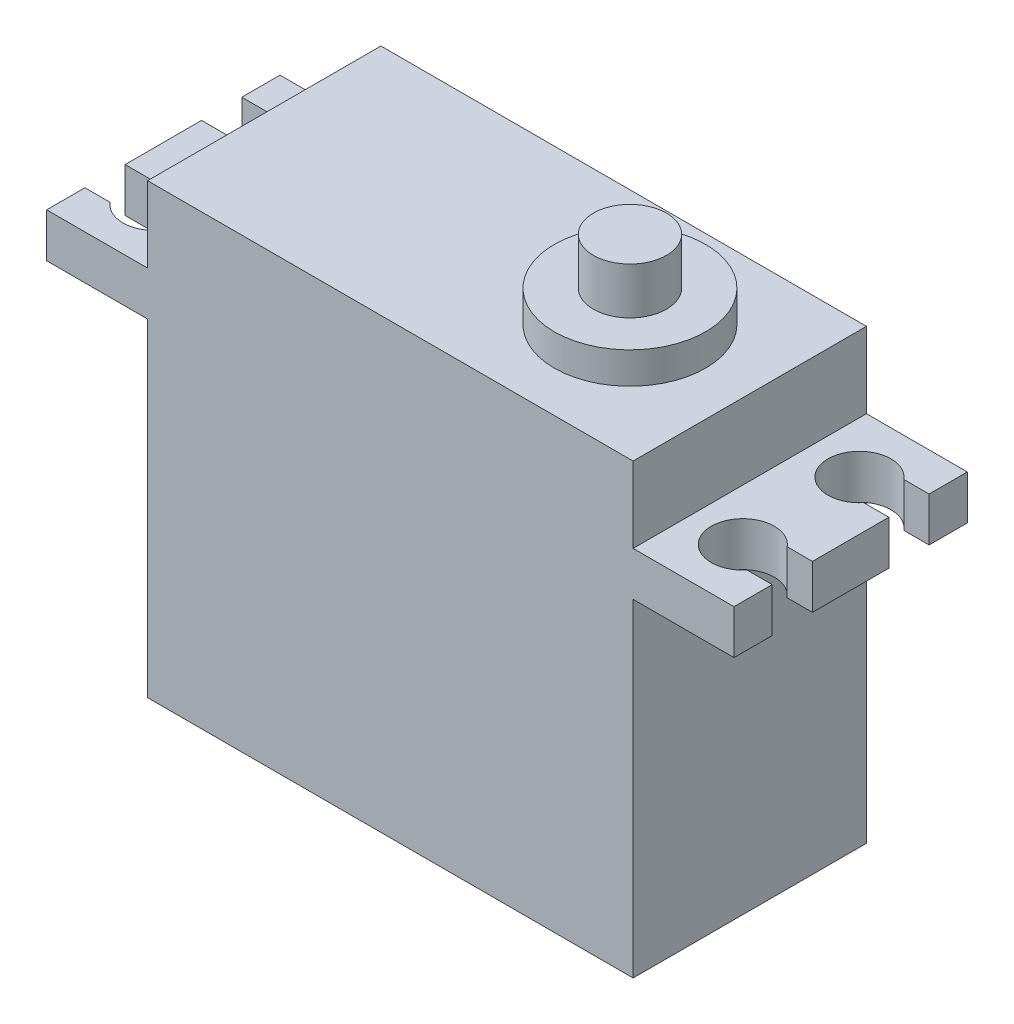
ISO-10303-21;
HEADER;
FILE_DESCRIPTION(('STEP AP214'),'2;1');
FILE_NAME('part.step','',(''),(''),'','','');
FILE_SCHEMA(('AUTOMOTIVE_DESIGN { 1 0 10303 214 1 1 1 1 }'));
ENDSEC;
DATA;
#1=APPLICATION_CONTEXT('core data for automotive mechanical design processes');
#2=APPLICATION_PROTOCOL_DEFINITION('international standard','automotive_design',2000,#1);
#3=PRODUCT_CONTEXT('',#1,'mechanical');
#4=PRODUCT('Part','Part','',(#3));
#5=PRODUCT_RELATED_PRODUCT_CATEGORY('part','',(#4));
#6=PRODUCT_DEFINITION_FORMATION('','',#4);
#7=PRODUCT_DEFINITION_CONTEXT('part definition',#1,'design');
#8=PRODUCT_DEFINITION('design','',#6,#7);
#9=PRODUCT_DEFINITION_SHAPE('','',#8);
#10=(LENGTH_UNIT() NAMED_UNIT(*) SI_UNIT(.MILLI.,.METRE.));
#11=(NAMED_UNIT(*) PLANE_ANGLE_UNIT() SI_UNIT($,.RADIAN.));
#12=(NAMED_UNIT(*) SI_UNIT($,.STERADIAN.) SOLID_ANGLE_UNIT());
#13=UNCERTAINTY_MEASURE_WITH_UNIT(LENGTH_MEASURE(1.E-05),#10,'distance_accuracy_value','');
#14=(GEOMETRIC_REPRESENTATION_CONTEXT(3) GLOBAL_UNCERTAINTY_ASSIGNED_CONTEXT((#13)) GLOBAL_UNIT_ASSIGNED_CONTEXT((#10,
#11,#12)) REPRESENTATION_CONTEXT('',''));
#15=CARTESIAN_POINT('',(0.,0.,0.));
#16=DIRECTION('',(0.,0.,1.));
#17=DIRECTION('',(1.,0.,0.));
#18=AXIS2_PLACEMENT_3D('',#15,#16,#17);
#19=CARTESIAN_POINT('',(-9.3497990620132,3.37443308731617,18.5));
#20=DIRECTION('',(0.,-1.,0.));
#21=DIRECTION('',(0.,0.,-1.));
#22=AXIS2_PLACEMENT_3D('',#19,#20,#21);
#23=PLANE('',#22);
#24=DIRECTION('',(0.,0.,1.));
#25=VECTOR('',#24,1.);
#26=CARTESIAN_POINT('',(-1.3497990620132,3.37443308731617,0.));
#27=LINE('',#26,#25);
#28=CARTESIAN_POINT('',(-1.3497990620132,3.37443308731617,0.));
#29=VERTEX_POINT('',#28);
#30=CARTESIAN_POINT('',(-1.3497990620132,3.37443308731617,18.5));
#31=VERTEX_POINT('',#30);
#32=EDGE_CURVE('E242',#29,#31,#27,.T.);
#33=ORIENTED_EDGE('',*,*,#32,.F.);
#34=DIRECTION('',(-1.,0.,0.));
#35=VECTOR('',#34,1.);
#36=CARTESIAN_POINT('',(-9.3497990620132,3.37443308731617,0.));
#37=LINE('',#36,#35);
#38=CARTESIAN_POINT('',(-9.3497990620132,3.37443308731617,0.));
#39=VERTEX_POINT('',#38);
#40=EDGE_CURVE('E375',#29,#39,#37,.T.);
#41=ORIENTED_EDGE('',*,*,#40,.T.);
#42=DIRECTION('',(0.,0.,-1.));
#43=VECTOR('',#42,1.);
#44=CARTESIAN_POINT('',(-9.3497990620132,3.37443308731617,18.5));
#45=LINE('',#44,#43);
#46=CARTESIAN_POINT('',(-9.3497990620132,3.37443308731617,3.03171141481607));
#47=VERTEX_POINT('',#46);
#48=EDGE_CURVE('E383',#47,#39,#45,.T.);
#49=ORIENTED_EDGE('',*,*,#48,.F.);
#50=DIRECTION('',(-1.,0.,0.));
#51=VECTOR('',#50,1.);
#52=CARTESIAN_POINT('',(-9.3497990620132,3.37443308731617,3.03171141481607));
#53=LINE('',#52,#51);
#54=CARTESIAN_POINT('',(-7.3497990620132,3.37443308731617,3.03171141481607));
#55=VERTEX_POINT('',#54);
#56=EDGE_CURVE('E290',#55,#47,#53,.T.);
#57=ORIENTED_EDGE('',*,*,#56,.F.);
#58=CARTESIAN_POINT('',(-5.42329147460987,3.37443308731617,4.625));
#59=DIRECTION('',(0.,1.,0.));
#60=DIRECTION('',(0.,0.,1.));
#61=AXIS2_PLACEMENT_3D('',#58,#59,#60);
#62=CIRCLE('',#61,2.5);
#63=CARTESIAN_POINT('',(-7.3497990620132,3.37443308731617,6.21828858518393));
#64=VERTEX_POINT('',#63);
#65=EDGE_CURVE('E287',#64,#55,#62,.T.);
#66=ORIENTED_EDGE('',*,*,#65,.F.);
#67=DIRECTION('',(1.,0.,0.));
#68=VECTOR('',#67,1.);
#69=CARTESIAN_POINT('',(-9.3497990620132,3.37443308731617,6.21828858518393));
#70=LINE('',#69,#68);
#71=CARTESIAN_POINT('',(-9.3497990620132,3.37443308731617,6.21828858518393));
#72=VERTEX_POINT('',#71);
#73=EDGE_CURVE('E260',#72,#64,#70,.T.);
#74=ORIENTED_EDGE('',*,*,#73,.F.);
#75=CARTESIAN_POINT('',(-9.3497990620132,3.37443308731617,12.2817114148161));
#76=VERTEX_POINT('',#75);
#77=EDGE_CURVE('E389',#76,#72,#45,.T.);
#78=ORIENTED_EDGE('',*,*,#77,.F.);
#79=DIRECTION('',(-1.,0.,0.));
#80=VECTOR('',#79,1.);
#81=CARTESIAN_POINT('',(-9.3497990620132,3.37443308731617,12.2817114148161));
#82=LINE('',#81,#80);
#83=CARTESIAN_POINT('',(-7.3497990620132,3.37443308731617,12.2817114148161));
#84=VERTEX_POINT('',#83);
#85=EDGE_CURVE('E300',#84,#76,#82,.T.);
#86=ORIENTED_EDGE('',*,*,#85,.F.);
#87=CARTESIAN_POINT('',(-5.42329147460987,3.37443308731617,13.875));
#88=DIRECTION('',(0.,1.,0.));
#89=DIRECTION('',(0.,0.,-1.));
#90=AXIS2_PLACEMENT_3D('',#87,#88,#89);
#91=CIRCLE('',#90,2.5);
#92=CARTESIAN_POINT('',(-7.3497990620132,3.37443308731617,15.4682885851839));
#93=VERTEX_POINT('',#92);
#94=EDGE_CURVE('E297',#93,#84,#91,.T.);
#95=ORIENTED_EDGE('',*,*,#94,.F.);
#96=DIRECTION('',(1.,0.,0.));
#97=VECTOR('',#96,1.);
#98=CARTESIAN_POINT('',(-9.3497990620132,3.37443308731617,15.4682885851839));
#99=LINE('',#98,#97);
#100=CARTESIAN_POINT('',(-9.3497990620132,3.37443308731617,15.4682885851839));
#101=VERTEX_POINT('',#100);
#102=EDGE_CURVE('E279',#101,#93,#99,.T.);
#103=ORIENTED_EDGE('',*,*,#102,.F.);
#104=CARTESIAN_POINT('',(-9.3497990620132,3.37443308731617,18.5));
#105=VERTEX_POINT('',#104);
#106=EDGE_CURVE('E385',#105,#101,#45,.T.);
#107=ORIENTED_EDGE('',*,*,#106,.F.);
#108=DIRECTION('',(-1.,0.,0.));
#109=VECTOR('',#108,1.);
#110=CARTESIAN_POINT('',(-9.3497990620132,3.37443308731617,18.5));
#111=LINE('',#110,#109);
#112=EDGE_CURVE('E49',#31,#105,#111,.T.);
#113=ORIENTED_EDGE('',*,*,#112,.F.);
#114=EDGE_LOOP('',(#33,#41,#49,#57,#66,#74,#78,#86,#95,#103,#107,#113));
#115=FACE_BOUND('',#114,.T.);
#116=ADVANCED_FACE('F33',(#115),#23,.F.);
#117=DIRECTION('',(0.,0.,-1.));
#118=VECTOR('',#117,1.);
#119=CARTESIAN_POINT('',(37.1502009379868,3.37443308731617,18.5));
#120=LINE('',#119,#118);
#121=CARTESIAN_POINT('',(37.1502009379868,3.37443308731617,18.5));
#122=VERTEX_POINT('',#121);
#123=CARTESIAN_POINT('',(37.1502009379868,3.37443308731617,0.));
#124=VERTEX_POINT('',#123);
#125=EDGE_CURVE('E57',#122,#124,#120,.T.);
#126=ORIENTED_EDGE('',*,*,#125,.F.);
#127=CARTESIAN_POINT('',(45.1502009379868,3.37443308731617,18.5));
#128=VERTEX_POINT('',#127);
#129=EDGE_CURVE('E356',#128,#122,#111,.T.);
#130=ORIENTED_EDGE('',*,*,#129,.F.);
#131=DIRECTION('',(0.,0.,-1.));
#132=VECTOR('',#131,1.);
#133=CARTESIAN_POINT('',(45.1502009379868,3.37443308731617,18.5));
#134=LINE('',#133,#132);
#135=CARTESIAN_POINT('',(45.1502009379868,3.37443308731617,15.4682885851839));
#136=VERTEX_POINT('',#135);
#137=EDGE_CURVE('E390',#128,#136,#134,.T.);
#138=ORIENTED_EDGE('',*,*,#137,.T.);
#139=DIRECTION('',(1.,0.,0.));
#140=VECTOR('',#139,1.);
#141=CARTESIAN_POINT('',(45.1502009379868,3.37443308731617,15.4682885851839));
#142=LINE('',#141,#140);
#143=CARTESIAN_POINT('',(43.1502009379868,3.37443308731617,15.4682885851839));
#144=VERTEX_POINT('',#143);
#145=EDGE_CURVE('E273',#144,#136,#142,.T.);
#146=ORIENTED_EDGE('',*,*,#145,.F.);
#147=CARTESIAN_POINT('',(41.2236933505835,3.37443308731617,13.875));
#148=DIRECTION('',(0.,1.,0.));
#149=DIRECTION('',(0.,0.,1.));
#150=AXIS2_PLACEMENT_3D('',#147,#148,#149);
#151=CIRCLE('',#150,2.5);
#152=CARTESIAN_POINT('',(43.1502009379868,3.37443308731617,12.2817114148161));
#153=VERTEX_POINT('',#152);
#154=EDGE_CURVE('E269',#153,#144,#151,.T.);
#155=ORIENTED_EDGE('',*,*,#154,.F.);
#156=DIRECTION('',(-1.,0.,0.));
#157=VECTOR('',#156,1.);
#158=CARTESIAN_POINT('',(45.1502009379868,3.37443308731617,12.2817114148161));
#159=LINE('',#158,#157);
#160=CARTESIAN_POINT('',(45.1502009379868,3.37443308731617,12.2817114148161));
#161=VERTEX_POINT('',#160);
#162=EDGE_CURVE('E266',#161,#153,#159,.T.);
#163=ORIENTED_EDGE('',*,*,#162,.F.);
#164=CARTESIAN_POINT('',(45.1502009379868,3.37443308731617,6.21828858518393));
#165=VERTEX_POINT('',#164);
#166=EDGE_CURVE('E394',#161,#165,#134,.T.);
#167=ORIENTED_EDGE('',*,*,#166,.T.);
#168=DIRECTION('',(1.,0.,0.));
#169=VECTOR('',#168,1.);
#170=CARTESIAN_POINT('',(45.1502009379868,3.37443308731617,6.21828858518393));
#171=LINE('',#170,#169);
#172=CARTESIAN_POINT('',(43.1502009379868,3.37443308731617,6.21828858518393));
#173=VERTEX_POINT('',#172);
#174=EDGE_CURVE('E254',#173,#165,#171,.T.);
#175=ORIENTED_EDGE('',*,*,#174,.F.);
#176=CARTESIAN_POINT('',(41.2236933505835,3.37443308731617,4.625));
#177=DIRECTION('',(0.,1.,0.));
#178=DIRECTION('',(0.,0.,-1.));
#179=AXIS2_PLACEMENT_3D('',#176,#177,#178);
#180=CIRCLE('',#179,2.5);
#181=CARTESIAN_POINT('',(43.1502009379868,3.37443308731617,3.03171141481607));
#182=VERTEX_POINT('',#181);
#183=EDGE_CURVE('E246',#182,#173,#180,.T.);
#184=ORIENTED_EDGE('',*,*,#183,.F.);
#185=DIRECTION('',(-1.,0.,0.));
#186=VECTOR('',#185,1.);
#187=CARTESIAN_POINT('',(45.1502009379868,3.37443308731617,3.03171141481607));
#188=LINE('',#187,#186);
#189=CARTESIAN_POINT('',(45.1502009379868,3.37443308731617,3.03171141481607));
#190=VERTEX_POINT('',#189);
#191=EDGE_CURVE('E243',#190,#182,#188,.T.);
#192=ORIENTED_EDGE('',*,*,#191,.F.);
#193=CARTESIAN_POINT('',(45.1502009379868,3.37443308731617,0.));
#194=VERTEX_POINT('',#193);
#195=EDGE_CURVE('E388',#190,#194,#134,.T.);
#196=ORIENTED_EDGE('',*,*,#195,.T.);
#197=EDGE_CURVE('E376',#194,#124,#37,.T.);
#198=ORIENTED_EDGE('',*,*,#197,.T.);
#199=EDGE_LOOP('',(#126,#130,#138,#146,#155,#163,#167,#175,#184,#192,#196,#198));
#200=FACE_BOUND('',#199,.T.);
#201=ADVANCED_FACE('F476',(#200),#23,.F.);
#202=CARTESIAN_POINT('',(45.1502009379868,3.37443308731617,18.5));
#203=DIRECTION('',(-1.,0.,0.));
#204=DIRECTION('',(0.,0.,1.));
#205=AXIS2_PLACEMENT_3D('',#202,#203,#204);
#206=PLANE('',#205);
#207=DIRECTION('',(0.,0.,-1.));
#208=VECTOR('',#207,1.);
#209=CARTESIAN_POINT('',(45.1502009379868,-0.125566912683819,18.5));
#210=LINE('',#209,#208);
#211=CARTESIAN_POINT('',(45.1502009379868,-0.125566912683819,18.5));
#212=VERTEX_POINT('',#211);
#213=CARTESIAN_POINT('',(45.1502009379868,-0.125566912683818,15.4682885851839));
#214=VERTEX_POINT('',#213);
#215=EDGE_CURVE('E395',#212,#214,#210,.T.);
#216=ORIENTED_EDGE('',*,*,#215,.T.);
#217=DIRECTION('',(0.,1.,0.));
#218=VECTOR('',#217,1.);
#219=CARTESIAN_POINT('',(45.1502009379868,-26.1255669126838,15.4682885851839));
#220=LINE('',#219,#218);
#221=EDGE_CURVE('E276',#214,#136,#220,.T.);
#222=ORIENTED_EDGE('',*,*,#221,.T.);
#223=ORIENTED_EDGE('',*,*,#137,.F.);
#224=DIRECTION('',(0.,1.,0.));
#225=VECTOR('',#224,1.);
#226=CARTESIAN_POINT('',(45.1502009379868,3.37443308731617,18.5));
#227=LINE('',#226,#225);
#228=EDGE_CURVE('E354',#212,#128,#227,.T.);
#229=ORIENTED_EDGE('',*,*,#228,.F.);
#230=EDGE_LOOP('',(#216,#222,#223,#229));
#231=FACE_BOUND('',#230,.T.);
#232=ADVANCED_FACE('F481',(#231),#206,.F.);
#233=ORIENTED_EDGE('',*,*,#166,.F.);
#234=DIRECTION('',(0.,1.,0.));
#235=VECTOR('',#234,1.);
#236=CARTESIAN_POINT('',(45.1502009379868,-26.1255669126838,12.2817114148161));
#237=LINE('',#236,#235);
#238=CARTESIAN_POINT('',(45.1502009379868,-0.125566912683818,12.2817114148161));
#239=VERTEX_POINT('',#238);
#240=EDGE_CURVE('E275',#239,#161,#237,.T.);
#241=ORIENTED_EDGE('',*,*,#240,.F.);
#242=CARTESIAN_POINT('',(45.1502009379868,-0.125566912683818,6.21828858518393));
#243=VERTEX_POINT('',#242);
#244=EDGE_CURVE('E399',#239,#243,#210,.T.);
#245=ORIENTED_EDGE('',*,*,#244,.T.);
#246=DIRECTION('',(0.,1.,0.));
#247=VECTOR('',#246,1.);
#248=CARTESIAN_POINT('',(45.1502009379868,-26.1255669126838,6.21828858518393));
#249=LINE('',#248,#247);
#250=EDGE_CURVE('E257',#243,#165,#249,.T.);
#251=ORIENTED_EDGE('',*,*,#250,.T.);
#252=EDGE_LOOP('',(#233,#241,#245,#251));
#253=FACE_BOUND('',#252,.T.);
#254=ADVANCED_FACE('F490',(#253),#206,.F.);
#255=CARTESIAN_POINT('',(-9.3497990620132,-0.125566912683826,18.5));
#256=DIRECTION('',(1.,0.,0.));
#257=DIRECTION('',(0.,0.,-1.));
#258=AXIS2_PLACEMENT_3D('',#255,#256,#257);
#259=PLANE('',#258);
#260=DIRECTION('',(0.,0.,-1.));
#261=VECTOR('',#260,1.);
#262=CARTESIAN_POINT('',(-9.3497990620132,-0.125566912683826,18.5));
#263=LINE('',#262,#261);
#264=CARTESIAN_POINT('',(-9.3497990620132,-0.125566912683825,3.03171141481607));
#265=VERTEX_POINT('',#264);
#266=CARTESIAN_POINT('',(-9.3497990620132,-0.125566912683826,0.));
#267=VERTEX_POINT('',#266);
#268=EDGE_CURVE('E360',#265,#267,#263,.T.);
#269=ORIENTED_EDGE('',*,*,#268,.F.);
#270=DIRECTION('',(0.,1.,0.));
#271=VECTOR('',#270,1.);
#272=CARTESIAN_POINT('',(-9.3497990620132,-0.125566912683826,3.03171141481607));
#273=LINE('',#272,#271);
#274=EDGE_CURVE('E37',#265,#47,#273,.T.);
#275=ORIENTED_EDGE('',*,*,#274,.T.);
#276=ORIENTED_EDGE('',*,*,#48,.T.);
#277=DIRECTION('',(0.,-1.,0.));
#278=VECTOR('',#277,1.);
#279=CARTESIAN_POINT('',(-9.3497990620132,-0.125566912683826,0.));
#280=LINE('',#279,#278);
#281=EDGE_CURVE('E346',#39,#267,#280,.T.);
#282=ORIENTED_EDGE('',*,*,#281,.T.);
#283=EDGE_LOOP('',(#269,#275,#276,#282));
#284=FACE_BOUND('',#283,.T.);
#285=ADVANCED_FACE('F427',(#284),#259,.F.);
#286=ORIENTED_EDGE('',*,*,#77,.T.);
#287=DIRECTION('',(0.,-1.,0.));
#288=VECTOR('',#287,1.);
#289=CARTESIAN_POINT('',(-9.3497990620132,-0.125566912683826,6.21828858518393));
#290=LINE('',#289,#288);
#291=CARTESIAN_POINT('',(-9.3497990620132,-0.125566912683826,6.21828858518393));
#292=VERTEX_POINT('',#291);
#293=EDGE_CURVE('E416',#72,#292,#290,.T.);
#294=ORIENTED_EDGE('',*,*,#293,.T.);
#295=CARTESIAN_POINT('',(-9.3497990620132,-0.125566912683825,12.2817114148161));
#296=VERTEX_POINT('',#295);
#297=EDGE_CURVE('E384',#296,#292,#263,.T.);
#298=ORIENTED_EDGE('',*,*,#297,.F.);
#299=DIRECTION('',(0.,1.,0.));
#300=VECTOR('',#299,1.);
#301=CARTESIAN_POINT('',(-9.3497990620132,-0.125566912683826,12.2817114148161));
#302=LINE('',#301,#300);
#303=EDGE_CURVE('E414',#296,#76,#302,.T.);
#304=ORIENTED_EDGE('',*,*,#303,.T.);
#305=EDGE_LOOP('',(#286,#294,#298,#304));
#306=FACE_BOUND('',#305,.T.);
#307=ADVANCED_FACE('F434',(#306),#259,.F.);
#308=CARTESIAN_POINT('',(-1.3497990620132,-0.125566912683824,18.5));
#309=DIRECTION('',(0.,1.,0.));
#310=DIRECTION('',(-1.,0.,0.));
#311=AXIS2_PLACEMENT_3D('',#308,#309,#310);
#312=PLANE('',#311);
#313=CARTESIAN_POINT('',(-5.42329147460987,-0.125566912683825,4.625));
#314=DIRECTION('',(0.,1.,0.));
#315=DIRECTION('',(-1.,0.,0.));
#316=AXIS2_PLACEMENT_3D('',#313,#314,#315);
#317=CIRCLE('',#316,2.5);
#318=CARTESIAN_POINT('',(-7.3497990620132,-0.125566912683825,6.21828858518393));
#319=VERTEX_POINT('',#318);
#320=CARTESIAN_POINT('',(-7.3497990620132,-0.125566912683825,3.03171141481607));
#321=VERTEX_POINT('',#320);
#322=EDGE_CURVE('E330',#319,#321,#317,.T.);
#323=ORIENTED_EDGE('',*,*,#322,.T.);
#324=DIRECTION('',(-1.,0.,0.));
#325=VECTOR('',#324,1.);
#326=CARTESIAN_POINT('',(-1.3497990620132,-0.125566912683824,3.03171141481607));
#327=LINE('',#326,#325);
#328=EDGE_CURVE('E315',#321,#265,#327,.T.);
#329=ORIENTED_EDGE('',*,*,#328,.T.);
#330=ORIENTED_EDGE('',*,*,#268,.T.);
#331=DIRECTION('',(1.,0.,0.));
#332=VECTOR('',#331,1.);
#333=CARTESIAN_POINT('',(-1.3497990620132,-0.125566912683824,0.));
#334=LINE('',#333,#332);
#335=CARTESIAN_POINT('',(-1.3497990620132,-0.125566912683824,0.));
#336=VERTEX_POINT('',#335);
#337=EDGE_CURVE('E342',#267,#336,#334,.T.);
#338=ORIENTED_EDGE('',*,*,#337,.T.);
#339=DIRECTION('',(0.,0.,-1.));
#340=VECTOR('',#339,1.);
#341=CARTESIAN_POINT('',(-1.3497990620132,-0.125566912683824,18.5));
#342=LINE('',#341,#340);
#343=CARTESIAN_POINT('',(-1.3497990620132,-0.125566912683824,18.5));
#344=VERTEX_POINT('',#343);
#345=EDGE_CURVE('E408',#344,#336,#342,.T.);
#346=ORIENTED_EDGE('',*,*,#345,.F.);
#347=DIRECTION('',(1.,0.,0.));
#348=VECTOR('',#347,1.);
#349=CARTESIAN_POINT('',(-1.3497990620132,-0.125566912683824,18.5));
#350=LINE('',#349,#348);
#351=CARTESIAN_POINT('',(-9.3497990620132,-0.125566912683826,18.5));
#352=VERTEX_POINT('',#351);
#353=EDGE_CURVE('E343',#352,#344,#350,.T.);
#354=ORIENTED_EDGE('',*,*,#353,.F.);
#355=CARTESIAN_POINT('',(-9.3497990620132,-0.125566912683826,15.4682885851839));
#356=VERTEX_POINT('',#355);
#357=EDGE_CURVE('E380',#352,#356,#263,.T.);
#358=ORIENTED_EDGE('',*,*,#357,.T.);
#359=DIRECTION('',(1.,0.,0.));
#360=VECTOR('',#359,1.);
#361=CARTESIAN_POINT('',(-1.3497990620132,-0.125566912683824,15.4682885851839));
#362=LINE('',#361,#360);
#363=CARTESIAN_POINT('',(-7.3497990620132,-0.125566912683825,15.4682885851839));
#364=VERTEX_POINT('',#363);
#365=EDGE_CURVE('E305',#356,#364,#362,.T.);
#366=ORIENTED_EDGE('',*,*,#365,.T.);
#367=CARTESIAN_POINT('',(-5.42329147460987,-0.125566912683825,13.875));
#368=DIRECTION('',(0.,1.,0.));
#369=DIRECTION('',(-1.,0.,0.));
#370=AXIS2_PLACEMENT_3D('',#367,#368,#369);
#371=CIRCLE('',#370,2.5);
#372=CARTESIAN_POINT('',(-7.3497990620132,-0.125566912683825,12.2817114148161));
#373=VERTEX_POINT('',#372);
#374=EDGE_CURVE('E318',#364,#373,#371,.T.);
#375=ORIENTED_EDGE('',*,*,#374,.T.);
#376=DIRECTION('',(-1.,0.,0.));
#377=VECTOR('',#376,1.);
#378=CARTESIAN_POINT('',(-1.3497990620132,-0.125566912683824,12.2817114148161));
#379=LINE('',#378,#377);
#380=EDGE_CURVE('E309',#373,#296,#379,.T.);
#381=ORIENTED_EDGE('',*,*,#380,.T.);
#382=ORIENTED_EDGE('',*,*,#297,.T.);
#383=DIRECTION('',(1.,0.,0.));
#384=VECTOR('',#383,1.);
#385=CARTESIAN_POINT('',(-1.3497990620132,-0.125566912683824,6.21828858518393));
#386=LINE('',#385,#384);
#387=EDGE_CURVE('E312',#292,#319,#386,.T.);
#388=ORIENTED_EDGE('',*,*,#387,.T.);
#389=EDGE_LOOP('',(#323,#329,#330,#338,#346,#354,#358,#366,#375,#381,#382,#388));
#390=FACE_BOUND('',#389,.T.);
#391=ADVANCED_FACE('F35',(#390),#312,.F.);
#392=CARTESIAN_POINT('',(-1.3497990620132,-26.1255669126838,18.5));
#393=DIRECTION('',(1.,0.,0.));
#394=DIRECTION('',(0.,0.,-1.));
#395=AXIS2_PLACEMENT_3D('',#392,#393,#394);
#396=PLANE('',#395);
#397=DIRECTION('',(0.,-1.,0.));
#398=VECTOR('',#397,1.);
#399=CARTESIAN_POINT('',(-1.3497990620132,-26.1255669126838,0.));
#400=LINE('',#399,#398);
#401=CARTESIAN_POINT('',(-1.3497990620132,-26.1255669126838,0.));
#402=VERTEX_POINT('',#401);
#403=EDGE_CURVE('E363',#336,#402,#400,.T.);
#404=ORIENTED_EDGE('',*,*,#403,.T.);
#405=DIRECTION('',(0.,0.,-1.));
#406=VECTOR('',#405,1.);
#407=CARTESIAN_POINT('',(-1.3497990620132,-26.1255669126838,18.5));
#408=LINE('',#407,#406);
#409=CARTESIAN_POINT('',(-1.3497990620132,-26.1255669126838,18.5));
#410=VERTEX_POINT('',#409);
#411=EDGE_CURVE('E405',#410,#402,#408,.T.);
#412=ORIENTED_EDGE('',*,*,#411,.F.);
#413=DIRECTION('',(0.,-1.,0.));
#414=VECTOR('',#413,1.);
#415=CARTESIAN_POINT('',(-1.3497990620132,-26.1255669126838,18.5));
#416=LINE('',#415,#414);
#417=EDGE_CURVE('E345',#344,#410,#416,.T.);
#418=ORIENTED_EDGE('',*,*,#417,.F.);
#419=ORIENTED_EDGE('',*,*,#345,.T.);
#420=EDGE_LOOP('',(#404,#412,#418,#419));
#421=FACE_BOUND('',#420,.T.);
#422=ADVANCED_FACE('F450',(#421),#396,.F.);
#423=CARTESIAN_POINT('',(37.1502009379868,-26.1255669126838,18.5));
#424=DIRECTION('',(0.,1.,0.));
#425=DIRECTION('',(-1.,0.,0.));
#426=AXIS2_PLACEMENT_3D('',#423,#424,#425);
#427=PLANE('',#426);
#428=DIRECTION('',(1.,0.,0.));
#429=VECTOR('',#428,1.);
#430=CARTESIAN_POINT('',(37.1502009379868,-26.1255669126838,0.));
#431=LINE('',#430,#429);
#432=CARTESIAN_POINT('',(37.1502009379868,-26.1255669126838,0.));
#433=VERTEX_POINT('',#432);
#434=EDGE_CURVE('E365',#402,#433,#431,.T.);
#435=ORIENTED_EDGE('',*,*,#434,.T.);
#436=DIRECTION('',(0.,0.,-1.));
#437=VECTOR('',#436,1.);
#438=CARTESIAN_POINT('',(37.1502009379868,-26.1255669126838,18.5));
#439=LINE('',#438,#437);
#440=CARTESIAN_POINT('',(37.1502009379868,-26.1255669126838,18.5));
#441=VERTEX_POINT('',#440);
#442=EDGE_CURVE('E402',#441,#433,#439,.T.);
#443=ORIENTED_EDGE('',*,*,#442,.F.);
#444=DIRECTION('',(1.,0.,0.));
#445=VECTOR('',#444,1.);
#446=CARTESIAN_POINT('',(37.1502009379868,-26.1255669126838,18.5));
#447=LINE('',#446,#445);
#448=EDGE_CURVE('E348',#410,#441,#447,.T.);
#449=ORIENTED_EDGE('',*,*,#448,.F.);
#450=ORIENTED_EDGE('',*,*,#411,.T.);
#451=EDGE_LOOP('',(#435,#443,#449,#450));
#452=FACE_BOUND('',#451,.T.);
#453=ADVANCED_FACE('F497',(#452),#427,.F.);
#454=CARTESIAN_POINT('',(37.1502009379868,-0.125566912683821,18.5));
#455=DIRECTION('',(-1.,0.,0.));
#456=DIRECTION('',(0.,0.,1.));
#457=AXIS2_PLACEMENT_3D('',#454,#455,#456);
#458=PLANE('',#457);
#459=DIRECTION('',(0.,1.,0.));
#460=VECTOR('',#459,1.);
#461=CARTESIAN_POINT('',(37.1502009379868,-0.125566912683821,0.));
#462=LINE('',#461,#460);
#463=CARTESIAN_POINT('',(37.1502009379868,-0.125566912683821,0.));
#464=VERTEX_POINT('',#463);
#465=EDGE_CURVE('E367',#433,#464,#462,.T.);
#466=ORIENTED_EDGE('',*,*,#465,.T.);
#467=DIRECTION('',(0.,0.,-1.));
#468=VECTOR('',#467,1.);
#469=CARTESIAN_POINT('',(37.1502009379868,-0.125566912683821,18.5));
#470=LINE('',#469,#468);
#471=CARTESIAN_POINT('',(37.1502009379868,-0.125566912683821,18.5));
#472=VERTEX_POINT('',#471);
#473=EDGE_CURVE('E398',#472,#464,#470,.T.);
#474=ORIENTED_EDGE('',*,*,#473,.F.);
#475=DIRECTION('',(0.,1.,0.));
#476=VECTOR('',#475,1.);
#477=CARTESIAN_POINT('',(37.1502009379868,-0.125566912683821,18.5));
#478=LINE('',#477,#476);
#479=EDGE_CURVE('E350',#441,#472,#478,.T.);
#480=ORIENTED_EDGE('',*,*,#479,.F.);
#481=ORIENTED_EDGE('',*,*,#442,.T.);
#482=EDGE_LOOP('',(#466,#474,#480,#481));
#483=FACE_BOUND('',#482,.T.);
#484=ADVANCED_FACE('F493',(#483),#458,.F.);
#485=CARTESIAN_POINT('',(45.1502009379868,-0.125566912683819,18.5));
#486=DIRECTION('',(0.,1.,0.));
#487=DIRECTION('',(-1.,0.,0.));
#488=AXIS2_PLACEMENT_3D('',#485,#486,#487);
#489=PLANE('',#488);
#490=CARTESIAN_POINT('',(41.2236933505835,-0.125566912683818,13.875));
#491=DIRECTION('',(0.,1.,0.));
#492=DIRECTION('',(-1.,0.,0.));
#493=AXIS2_PLACEMENT_3D('',#490,#491,#492);
#494=CIRCLE('',#493,2.5);
#495=CARTESIAN_POINT('',(43.1502009379868,-0.125566912683818,12.2817114148161));
#496=VERTEX_POINT('',#495);
#497=CARTESIAN_POINT('',(43.1502009379868,-0.125566912683818,15.4682885851839));
#498=VERTEX_POINT('',#497);
#499=EDGE_CURVE('E336',#496,#498,#494,.T.);
#500=ORIENTED_EDGE('',*,*,#499,.T.);
#501=DIRECTION('',(1.,0.,0.));
#502=VECTOR('',#501,1.);
#503=CARTESIAN_POINT('',(45.1502009379868,-0.125566912683819,15.4682885851839));
#504=LINE('',#503,#502);
#505=EDGE_CURVE('E339',#498,#214,#504,.T.);
#506=ORIENTED_EDGE('',*,*,#505,.T.);
#507=ORIENTED_EDGE('',*,*,#215,.F.);
#508=DIRECTION('',(1.,0.,0.));
#509=VECTOR('',#508,1.);
#510=CARTESIAN_POINT('',(45.1502009379868,-0.125566912683819,18.5));
#511=LINE('',#510,#509);
#512=EDGE_CURVE('E352',#472,#212,#511,.T.);
#513=ORIENTED_EDGE('',*,*,#512,.F.);
#514=ORIENTED_EDGE('',*,*,#473,.T.);
#515=DIRECTION('',(1.,0.,0.));
#516=VECTOR('',#515,1.);
#517=CARTESIAN_POINT('',(45.1502009379868,-0.125566912683819,0.));
#518=LINE('',#517,#516);
#519=CARTESIAN_POINT('',(45.1502009379868,-0.125566912683819,0.));
#520=VERTEX_POINT('',#519);
#521=EDGE_CURVE('E369',#464,#520,#518,.T.);
#522=ORIENTED_EDGE('',*,*,#521,.T.);
#523=CARTESIAN_POINT('',(45.1502009379868,-0.125566912683818,3.03171141481607));
#524=VERTEX_POINT('',#523);
#525=EDGE_CURVE('E393',#524,#520,#210,.T.);
#526=ORIENTED_EDGE('',*,*,#525,.F.);
#527=DIRECTION('',(-1.,0.,0.));
#528=VECTOR('',#527,1.);
#529=CARTESIAN_POINT('',(45.1502009379868,-0.125566912683819,3.03171141481607));
#530=LINE('',#529,#528);
#531=CARTESIAN_POINT('',(43.1502009379868,-0.125566912683818,3.03171141481607));
#532=VERTEX_POINT('',#531);
#533=EDGE_CURVE('E321',#524,#532,#530,.T.);
#534=ORIENTED_EDGE('',*,*,#533,.T.);
#535=CARTESIAN_POINT('',(41.2236933505835,-0.125566912683818,4.625));
#536=DIRECTION('',(0.,1.,0.));
#537=DIRECTION('',(-1.,0.,0.));
#538=AXIS2_PLACEMENT_3D('',#535,#536,#537);
#539=CIRCLE('',#538,2.5);
#540=CARTESIAN_POINT('',(43.1502009379868,-0.125566912683818,6.21828858518393));
#541=VERTEX_POINT('',#540);
#542=EDGE_CURVE('E324',#532,#541,#539,.T.);
#543=ORIENTED_EDGE('',*,*,#542,.T.);
#544=DIRECTION('',(1.,0.,0.));
#545=VECTOR('',#544,1.);
#546=CARTESIAN_POINT('',(45.1502009379868,-0.125566912683819,6.21828858518393));
#547=LINE('',#546,#545);
#548=EDGE_CURVE('E327',#541,#243,#547,.T.);
#549=ORIENTED_EDGE('',*,*,#548,.T.);
#550=ORIENTED_EDGE('',*,*,#244,.F.);
#551=DIRECTION('',(-1.,0.,0.));
#552=VECTOR('',#551,1.);
#553=CARTESIAN_POINT('',(45.1502009379868,-0.125566912683819,12.2817114148161));
#554=LINE('',#553,#552);
#555=EDGE_CURVE('E333',#239,#496,#554,.T.);
#556=ORIENTED_EDGE('',*,*,#555,.T.);
#557=EDGE_LOOP('',(#500,#506,#507,#513,#514,#522,#526,#534,#543,#549,#550,#556));
#558=FACE_BOUND('',#557,.T.);
#559=ADVANCED_FACE('F488',(#558),#489,.F.);
#560=ORIENTED_EDGE('',*,*,#195,.F.);
#561=DIRECTION('',(0.,1.,0.));
#562=VECTOR('',#561,1.);
#563=CARTESIAN_POINT('',(45.1502009379868,-26.1255669126838,3.03171141481607));
#564=LINE('',#563,#562);
#565=EDGE_CURVE('E256',#524,#190,#564,.T.);
#566=ORIENTED_EDGE('',*,*,#565,.F.);
#567=ORIENTED_EDGE('',*,*,#525,.T.);
#568=DIRECTION('',(0.,1.,0.));
#569=VECTOR('',#568,1.);
#570=CARTESIAN_POINT('',(45.1502009379868,3.37443308731617,0.));
#571=LINE('',#570,#569);
#572=EDGE_CURVE('E372',#520,#194,#571,.T.);
#573=ORIENTED_EDGE('',*,*,#572,.T.);
#574=EDGE_LOOP('',(#560,#566,#567,#573));
#575=FACE_BOUND('',#574,.T.);
#576=ADVANCED_FACE('F485',(#575),#206,.F.);
#577=ORIENTED_EDGE('',*,*,#106,.T.);
#578=DIRECTION('',(0.,-1.,0.));
#579=VECTOR('',#578,1.);
#580=CARTESIAN_POINT('',(-9.3497990620132,-0.125566912683826,15.4682885851839));
#581=LINE('',#580,#579);
#582=EDGE_CURVE('E411',#101,#356,#581,.T.);
#583=ORIENTED_EDGE('',*,*,#582,.T.);
#584=ORIENTED_EDGE('',*,*,#357,.F.);
#585=DIRECTION('',(0.,-1.,0.));
#586=VECTOR('',#585,1.);
#587=CARTESIAN_POINT('',(-9.3497990620132,-0.125566912683826,18.5));
#588=LINE('',#587,#586);
#589=EDGE_CURVE('E358',#105,#352,#588,.T.);
#590=ORIENTED_EDGE('',*,*,#589,.F.);
#591=EDGE_LOOP('',(#577,#583,#584,#590));
#592=FACE_BOUND('',#591,.T.);
#593=ADVANCED_FACE('F455',(#592),#259,.F.);
#594=CARTESIAN_POINT('',(0.,0.,18.5));
#595=DIRECTION('',(0.,0.,-1.));
#596=DIRECTION('',(-1.,0.,0.));
#597=AXIS2_PLACEMENT_3D('',#594,#595,#596);
#598=PLANE('',#597);
#599=ORIENTED_EDGE('',*,*,#353,.T.);
#600=ORIENTED_EDGE('',*,*,#417,.T.);
#601=ORIENTED_EDGE('',*,*,#448,.T.);
#602=ORIENTED_EDGE('',*,*,#479,.T.);
#603=ORIENTED_EDGE('',*,*,#512,.T.);
#604=ORIENTED_EDGE('',*,*,#228,.T.);
#605=ORIENTED_EDGE('',*,*,#129,.T.);
#606=DIRECTION('',(0.,-1.,0.));
#607=VECTOR('',#606,1.);
#608=CARTESIAN_POINT('',(37.1502009379868,9.37443308731618,18.5));
#609=LINE('',#608,#607);
#610=CARTESIAN_POINT('',(37.1502009379868,9.37443308731618,18.5));
#611=VERTEX_POINT('',#610);
#612=EDGE_CURVE('E227',#611,#122,#609,.T.);
#613=ORIENTED_EDGE('',*,*,#612,.F.);
#614=DIRECTION('',(1.,0.,0.));
#615=VECTOR('',#614,1.);
#616=CARTESIAN_POINT('',(-1.3497990620132,9.37443308731618,18.5));
#617=LINE('',#616,#615);
#618=CARTESIAN_POINT('',(-1.3497990620132,9.37443308731618,18.5));
#619=VERTEX_POINT('',#618);
#620=EDGE_CURVE('E219',#619,#611,#617,.T.);
#621=ORIENTED_EDGE('',*,*,#620,.F.);
#622=DIRECTION('',(0.,-1.,0.));
#623=VECTOR('',#622,1.);
#624=CARTESIAN_POINT('',(-1.3497990620132,9.37443308731618,18.5));
#625=LINE('',#624,#623);
#626=EDGE_CURVE('E224',#619,#31,#625,.T.);
#627=ORIENTED_EDGE('',*,*,#626,.T.);
#628=ORIENTED_EDGE('',*,*,#112,.T.);
#629=ORIENTED_EDGE('',*,*,#589,.T.);
#630=EDGE_LOOP('',(#599,#600,#601,#602,#603,#604,#605,#613,#621,#627,#628,#629));
#631=FACE_BOUND('',#630,.T.);
#632=ADVANCED_FACE('F222',(#631),#598,.F.);
#633=CARTESIAN_POINT('',(0.,0.,0.));
#634=DIRECTION('',(0.,0.,-1.));
#635=DIRECTION('',(-1.,0.,0.));
#636=AXIS2_PLACEMENT_3D('',#633,#634,#635);
#637=PLANE('',#636);
#638=ORIENTED_EDGE('',*,*,#337,.F.);
#639=ORIENTED_EDGE('',*,*,#281,.F.);
#640=ORIENTED_EDGE('',*,*,#40,.F.);
#641=DIRECTION('',(0.,-1.,0.));
#642=VECTOR('',#641,1.);
#643=CARTESIAN_POINT('',(-1.3497990620132,9.37443308731618,0.));
#644=LINE('',#643,#642);
#645=CARTESIAN_POINT('',(-1.3497990620132,9.37443308731618,0.));
#646=VERTEX_POINT('',#645);
#647=EDGE_CURVE('E732',#646,#29,#644,.T.);
#648=ORIENTED_EDGE('',*,*,#647,.F.);
#649=DIRECTION('',(-1.,0.,0.));
#650=VECTOR('',#649,1.);
#651=CARTESIAN_POINT('',(37.1502009379868,9.37443308731618,0.));
#652=LINE('',#651,#650);
#653=CARTESIAN_POINT('',(37.1502009379868,9.37443308731618,0.));
#654=VERTEX_POINT('',#653);
#655=EDGE_CURVE('E236',#654,#646,#652,.T.);
#656=ORIENTED_EDGE('',*,*,#655,.F.);
#657=DIRECTION('',(0.,-1.,0.));
#658=VECTOR('',#657,1.);
#659=CARTESIAN_POINT('',(37.1502009379868,9.37443308731618,0.));
#660=LINE('',#659,#658);
#661=EDGE_CURVE('E248',#654,#124,#660,.T.);
#662=ORIENTED_EDGE('',*,*,#661,.T.);
#663=ORIENTED_EDGE('',*,*,#197,.F.);
#664=ORIENTED_EDGE('',*,*,#572,.F.);
#665=ORIENTED_EDGE('',*,*,#521,.F.);
#666=ORIENTED_EDGE('',*,*,#465,.F.);
#667=ORIENTED_EDGE('',*,*,#434,.F.);
#668=ORIENTED_EDGE('',*,*,#403,.F.);
#669=EDGE_LOOP('',(#638,#639,#640,#648,#656,#662,#663,#664,#665,#666,#667,#668));
#670=FACE_BOUND('',#669,.T.);
#671=ADVANCED_FACE('F445',(#670),#637,.T.);
#672=CARTESIAN_POINT('',(-5.42329147460987,-26.1255669126838,13.875));
#673=DIRECTION('',(0.,1.,0.));
#674=DIRECTION('',(0.,0.,1.));
#675=AXIS2_PLACEMENT_3D('',#672,#673,#674);
#676=CYLINDRICAL_SURFACE('',#675,2.5);
#677=DIRECTION('',(0.,1.,0.));
#678=VECTOR('',#677,1.);
#679=CARTESIAN_POINT('',(-7.3497990620132,-26.1255669126838,15.4682885851839));
#680=LINE('',#679,#678);
#681=EDGE_CURVE('E302',#364,#93,#680,.T.);
#682=ORIENTED_EDGE('',*,*,#681,.T.);
#683=ORIENTED_EDGE('',*,*,#94,.T.);
#684=DIRECTION('',(0.,1.,0.));
#685=VECTOR('',#684,1.);
#686=CARTESIAN_POINT('',(-7.3497990620132,-26.1255669126838,12.2817114148161));
#687=LINE('',#686,#685);
#688=EDGE_CURVE('E303',#373,#84,#687,.T.);
#689=ORIENTED_EDGE('',*,*,#688,.F.);
#690=ORIENTED_EDGE('',*,*,#374,.F.);
#691=EDGE_LOOP('',(#682,#683,#689,#690));
#692=FACE_BOUND('',#691,.T.);
#693=ADVANCED_FACE('F462',(#692),#676,.F.);
#694=CARTESIAN_POINT('',(-9.3497990620132,-26.1255669126838,12.2817114148161));
#695=DIRECTION('',(0.,0.,-1.));
#696=DIRECTION('',(-1.,0.,0.));
#697=AXIS2_PLACEMENT_3D('',#694,#695,#696);
#698=PLANE('',#697);
#699=ORIENTED_EDGE('',*,*,#688,.T.);
#700=ORIENTED_EDGE('',*,*,#85,.T.);
#701=ORIENTED_EDGE('',*,*,#303,.F.);
#702=ORIENTED_EDGE('',*,*,#380,.F.);
#703=EDGE_LOOP('',(#699,#700,#701,#702));
#704=FACE_BOUND('',#703,.T.);
#705=ADVANCED_FACE('F464',(#704),#698,.F.);
#706=CARTESIAN_POINT('',(-9.3497990620132,-26.1255669126838,15.4682885851839));
#707=DIRECTION('',(0.,0.,1.));
#708=DIRECTION('',(1.,0.,0.));
#709=AXIS2_PLACEMENT_3D('',#706,#707,#708);
#710=PLANE('',#709);
#711=ORIENTED_EDGE('',*,*,#582,.F.);
#712=ORIENTED_EDGE('',*,*,#102,.T.);
#713=ORIENTED_EDGE('',*,*,#681,.F.);
#714=ORIENTED_EDGE('',*,*,#365,.F.);
#715=EDGE_LOOP('',(#711,#712,#713,#714));
#716=FACE_BOUND('',#715,.T.);
#717=ADVANCED_FACE('F458',(#716),#710,.F.);
#718=CARTESIAN_POINT('',(-5.42329147460987,-26.1255669126838,4.625));
#719=DIRECTION('',(0.,1.,0.));
#720=DIRECTION('',(0.,0.,1.));
#721=AXIS2_PLACEMENT_3D('',#718,#719,#720);
#722=CYLINDRICAL_SURFACE('',#721,2.5);
#723=DIRECTION('',(0.,1.,0.));
#724=VECTOR('',#723,1.);
#725=CARTESIAN_POINT('',(-7.3497990620132,-26.1255669126838,6.21828858518393));
#726=LINE('',#725,#724);
#727=EDGE_CURVE('E292',#319,#64,#726,.T.);
#728=ORIENTED_EDGE('',*,*,#727,.T.);
#729=ORIENTED_EDGE('',*,*,#65,.T.);
#730=DIRECTION('',(0.,1.,0.));
#731=VECTOR('',#730,1.);
#732=CARTESIAN_POINT('',(-7.3497990620132,-26.1255669126838,3.03171141481607));
#733=LINE('',#732,#731);
#734=EDGE_CURVE('E270',#321,#55,#733,.T.);
#735=ORIENTED_EDGE('',*,*,#734,.F.);
#736=ORIENTED_EDGE('',*,*,#322,.F.);
#737=EDGE_LOOP('',(#728,#729,#735,#736));
#738=FACE_BOUND('',#737,.T.);
#739=ADVANCED_FACE('F471',(#738),#722,.F.);
#740=CARTESIAN_POINT('',(-9.3497990620132,-26.1255669126838,3.03171141481607));
#741=DIRECTION('',(0.,0.,-1.));
#742=DIRECTION('',(-1.,0.,0.));
#743=AXIS2_PLACEMENT_3D('',#740,#741,#742);
#744=PLANE('',#743);
#745=ORIENTED_EDGE('',*,*,#734,.T.);
#746=ORIENTED_EDGE('',*,*,#56,.T.);
#747=ORIENTED_EDGE('',*,*,#274,.F.);
#748=ORIENTED_EDGE('',*,*,#328,.F.);
#749=EDGE_LOOP('',(#745,#746,#747,#748));
#750=FACE_BOUND('',#749,.T.);
#751=ADVANCED_FACE('F549',(#750),#744,.F.);
#752=CARTESIAN_POINT('',(-9.3497990620132,-26.1255669126838,6.21828858518393));
#753=DIRECTION('',(0.,0.,1.));
#754=DIRECTION('',(1.,0.,0.));
#755=AXIS2_PLACEMENT_3D('',#752,#753,#754);
#756=PLANE('',#755);
#757=ORIENTED_EDGE('',*,*,#293,.F.);
#758=ORIENTED_EDGE('',*,*,#73,.T.);
#759=ORIENTED_EDGE('',*,*,#727,.F.);
#760=ORIENTED_EDGE('',*,*,#387,.F.);
#761=EDGE_LOOP('',(#757,#758,#759,#760));
#762=FACE_BOUND('',#761,.T.);
#763=ADVANCED_FACE('F440',(#762),#756,.F.);
#764=CARTESIAN_POINT('',(45.1502009379868,-26.1255669126838,6.21828858518393));
#765=DIRECTION('',(0.,0.,1.));
#766=DIRECTION('',(1.,0.,0.));
#767=AXIS2_PLACEMENT_3D('',#764,#765,#766);
#768=PLANE('',#767);
#769=DIRECTION('',(0.,1.,0.));
#770=VECTOR('',#769,1.);
#771=CARTESIAN_POINT('',(43.1502009379868,-26.1255669126838,6.21828858518393));
#772=LINE('',#771,#770);
#773=EDGE_CURVE('E261',#541,#173,#772,.T.);
#774=ORIENTED_EDGE('',*,*,#773,.T.);
#775=ORIENTED_EDGE('',*,*,#174,.T.);
#776=ORIENTED_EDGE('',*,*,#250,.F.);
#777=ORIENTED_EDGE('',*,*,#548,.F.);
#778=EDGE_LOOP('',(#774,#775,#776,#777));
#779=FACE_BOUND('',#778,.T.);
#780=ADVANCED_FACE('F567',(#779),#768,.F.);
#781=CARTESIAN_POINT('',(41.2236933505835,-26.1255669126838,4.625));
#782=DIRECTION('',(0.,1.,0.));
#783=DIRECTION('',(0.,0.,1.));
#784=AXIS2_PLACEMENT_3D('',#781,#782,#783);
#785=CYLINDRICAL_SURFACE('',#784,2.5);
#786=DIRECTION('',(0.,1.,0.));
#787=VECTOR('',#786,1.);
#788=CARTESIAN_POINT('',(43.1502009379868,-26.1255669126838,3.03171141481607));
#789=LINE('',#788,#787);
#790=EDGE_CURVE('E263',#532,#182,#789,.T.);
#791=ORIENTED_EDGE('',*,*,#790,.T.);
#792=ORIENTED_EDGE('',*,*,#183,.T.);
#793=ORIENTED_EDGE('',*,*,#773,.F.);
#794=ORIENTED_EDGE('',*,*,#542,.F.);
#795=EDGE_LOOP('',(#791,#792,#793,#794));
#796=FACE_BOUND('',#795,.T.);
#797=ADVANCED_FACE('F575',(#796),#785,.F.);
#798=CARTESIAN_POINT('',(45.1502009379868,-26.1255669126838,3.03171141481607));
#799=DIRECTION('',(0.,0.,-1.));
#800=DIRECTION('',(-1.,0.,0.));
#801=AXIS2_PLACEMENT_3D('',#798,#799,#800);
#802=PLANE('',#801);
#803=ORIENTED_EDGE('',*,*,#565,.T.);
#804=ORIENTED_EDGE('',*,*,#191,.T.);
#805=ORIENTED_EDGE('',*,*,#790,.F.);
#806=ORIENTED_EDGE('',*,*,#533,.F.);
#807=EDGE_LOOP('',(#803,#804,#805,#806));
#808=FACE_BOUND('',#807,.T.);
#809=ADVANCED_FACE('F585',(#808),#802,.F.);
#810=CARTESIAN_POINT('',(45.1502009379868,-26.1255669126838,15.4682885851839));
#811=DIRECTION('',(0.,0.,1.));
#812=DIRECTION('',(1.,0.,0.));
#813=AXIS2_PLACEMENT_3D('',#810,#811,#812);
#814=PLANE('',#813);
#815=DIRECTION('',(0.,1.,0.));
#816=VECTOR('',#815,1.);
#817=CARTESIAN_POINT('',(43.1502009379868,-26.1255669126838,15.4682885851839));
#818=LINE('',#817,#816);
#819=EDGE_CURVE('E280',#498,#144,#818,.T.);
#820=ORIENTED_EDGE('',*,*,#819,.T.);
#821=ORIENTED_EDGE('',*,*,#145,.T.);
#822=ORIENTED_EDGE('',*,*,#221,.F.);
#823=ORIENTED_EDGE('',*,*,#505,.F.);
#824=EDGE_LOOP('',(#820,#821,#822,#823));
#825=FACE_BOUND('',#824,.T.);
#826=ADVANCED_FACE('F595',(#825),#814,.F.);
#827=CARTESIAN_POINT('',(41.2236933505835,-26.1255669126838,13.875));
#828=DIRECTION('',(0.,1.,0.));
#829=DIRECTION('',(0.,0.,1.));
#830=AXIS2_PLACEMENT_3D('',#827,#828,#829);
#831=CYLINDRICAL_SURFACE('',#830,2.5);
#832=DIRECTION('',(0.,1.,0.));
#833=VECTOR('',#832,1.);
#834=CARTESIAN_POINT('',(43.1502009379868,-26.1255669126838,12.2817114148161));
#835=LINE('',#834,#833);
#836=EDGE_CURVE('E282',#496,#153,#835,.T.);
#837=ORIENTED_EDGE('',*,*,#836,.T.);
#838=ORIENTED_EDGE('',*,*,#154,.T.);
#839=ORIENTED_EDGE('',*,*,#819,.F.);
#840=ORIENTED_EDGE('',*,*,#499,.F.);
#841=EDGE_LOOP('',(#837,#838,#839,#840));
#842=FACE_BOUND('',#841,.T.);
#843=ADVANCED_FACE('F605',(#842),#831,.F.);
#844=CARTESIAN_POINT('',(45.1502009379868,-26.1255669126838,12.2817114148161));
#845=DIRECTION('',(0.,0.,-1.));
#846=DIRECTION('',(-1.,0.,0.));
#847=AXIS2_PLACEMENT_3D('',#844,#845,#846);
#848=PLANE('',#847);
#849=ORIENTED_EDGE('',*,*,#240,.T.);
#850=ORIENTED_EDGE('',*,*,#162,.T.);
#851=ORIENTED_EDGE('',*,*,#836,.F.);
#852=ORIENTED_EDGE('',*,*,#555,.F.);
#853=EDGE_LOOP('',(#849,#850,#851,#852));
#854=FACE_BOUND('',#853,.T.);
#855=ADVANCED_FACE('F615',(#854),#848,.F.);
#856=CARTESIAN_POINT('',(-1.3497990620132,9.37443308731618,0.));
#857=DIRECTION('',(1.,0.,0.));
#858=DIRECTION('',(0.,0.,-1.));
#859=AXIS2_PLACEMENT_3D('',#856,#857,#858);
#860=PLANE('',#859);
#861=ORIENTED_EDGE('',*,*,#32,.T.);
#862=ORIENTED_EDGE('',*,*,#626,.F.);
#863=DIRECTION('',(0.,0.,1.));
#864=VECTOR('',#863,1.);
#865=CARTESIAN_POINT('',(-1.3497990620132,9.37443308731618,0.));
#866=LINE('',#865,#864);
#867=EDGE_CURVE('E231',#646,#619,#866,.T.);
#868=ORIENTED_EDGE('',*,*,#867,.F.);
#869=ORIENTED_EDGE('',*,*,#647,.T.);
#870=EDGE_LOOP('',(#861,#862,#868,#869));
#871=FACE_BOUND('',#870,.T.);
#872=ADVANCED_FACE('F241',(#871),#860,.F.);
#873=CARTESIAN_POINT('',(37.1502009379868,9.37443308731618,18.5));
#874=DIRECTION('',(-1.,0.,0.));
#875=DIRECTION('',(0.,0.,1.));
#876=AXIS2_PLACEMENT_3D('',#873,#874,#875);
#877=PLANE('',#876);
#878=ORIENTED_EDGE('',*,*,#125,.T.);
#879=ORIENTED_EDGE('',*,*,#661,.F.);
#880=DIRECTION('',(0.,0.,-1.));
#881=VECTOR('',#880,1.);
#882=CARTESIAN_POINT('',(37.1502009379868,9.37443308731618,18.5));
#883=LINE('',#882,#881);
#884=EDGE_CURVE('E230',#611,#654,#883,.T.);
#885=ORIENTED_EDGE('',*,*,#884,.F.);
#886=ORIENTED_EDGE('',*,*,#612,.T.);
#887=EDGE_LOOP('',(#878,#879,#885,#886));
#888=FACE_BOUND('',#887,.T.);
#889=ADVANCED_FACE('F658',(#888),#877,.F.);
#890=CARTESIAN_POINT('',(0.,9.37443308731618,0.));
#891=DIRECTION('',(0.,1.,0.));
#892=DIRECTION('',(0.,0.,1.));
#893=AXIS2_PLACEMENT_3D('',#890,#891,#892);
#894=PLANE('',#893);
#895=CARTESIAN_POINT('',(27.6502009379868,9.37443308731618,9.25));
#896=DIRECTION('',(0.,1.,0.));
#897=DIRECTION('',(0.,0.,1.));
#898=AXIS2_PLACEMENT_3D('',#895,#896,#897);
#899=CIRCLE('',#898,6.);
#900=CARTESIAN_POINT('',(27.6502009379868,9.37443308731618,15.25));
#901=VERTEX_POINT('',#900);
#902=EDGE_CURVE('E722',#901,#901,#899,.T.);
#903=ORIENTED_EDGE('',*,*,#902,.F.);
#904=EDGE_LOOP('',(#903));
#905=FACE_BOUND('',#904,.T.);
#906=ORIENTED_EDGE('',*,*,#867,.T.);
#907=ORIENTED_EDGE('',*,*,#620,.T.);
#908=ORIENTED_EDGE('',*,*,#884,.T.);
#909=ORIENTED_EDGE('',*,*,#655,.T.);
#910=EDGE_LOOP('',(#906,#907,#908,#909));
#911=FACE_BOUND('',#910,.T.);
#912=ADVANCED_FACE('F234',(#905,#911),#894,.T.);
#913=CARTESIAN_POINT('',(27.6502009379868,11.8744330873162,9.25));
#914=DIRECTION('',(0.,-1.,0.));
#915=DIRECTION('',(0.,0.,-1.));
#916=AXIS2_PLACEMENT_3D('',#913,#914,#915);
#917=CYLINDRICAL_SURFACE('',#916,6.);
#918=CARTESIAN_POINT('',(27.6502009379868,11.8744330873162,9.25));
#919=DIRECTION('',(0.,1.,0.));
#920=DIRECTION('',(0.,0.,1.));
#921=AXIS2_PLACEMENT_3D('',#918,#919,#920);
#922=CIRCLE('',#921,6.);
#923=CARTESIAN_POINT('',(27.6502009379868,11.8744330873162,15.25));
#924=VERTEX_POINT('',#923);
#925=EDGE_CURVE('E725',#924,#924,#922,.T.);
#926=ORIENTED_EDGE('',*,*,#925,.F.);
#927=EDGE_LOOP('',(#926));
#928=FACE_BOUND('',#927,.T.);
#929=ORIENTED_EDGE('',*,*,#902,.T.);
#930=EDGE_LOOP('',(#929));
#931=FACE_BOUND('',#930,.T.);
#932=ADVANCED_FACE('F674',(#928,#931),#917,.T.);
#933=CARTESIAN_POINT('',(27.6502009379868,11.8744330873162,9.25));
#934=DIRECTION('',(0.,1.,0.));
#935=DIRECTION('',(0.,0.,1.));
#936=AXIS2_PLACEMENT_3D('',#933,#934,#935);
#937=PLANE('',#936);
#938=CARTESIAN_POINT('',(27.6502009379868,11.8744330873162,9.25));
#939=DIRECTION('',(0.,1.,0.));
#940=DIRECTION('',(0.,0.,1.));
#941=AXIS2_PLACEMENT_3D('',#938,#939,#940);
#942=CIRCLE('',#941,2.9);
#943=CARTESIAN_POINT('',(27.6502009379868,11.8744330873162,12.15));
#944=VERTEX_POINT('',#943);
#945=EDGE_CURVE('E11',#944,#944,#942,.T.);
#946=ORIENTED_EDGE('',*,*,#945,.F.);
#947=EDGE_LOOP('',(#946));
#948=FACE_BOUND('',#947,.T.);
#949=ORIENTED_EDGE('',*,*,#925,.T.);
#950=EDGE_LOOP('',(#949));
#951=FACE_BOUND('',#950,.T.);
#952=ADVANCED_FACE('F683',(#948,#951),#937,.T.);
#953=CARTESIAN_POINT('',(27.6502009379868,15.5744330873162,9.25));
#954=DIRECTION('',(0.,-1.,0.));
#955=DIRECTION('',(0.,0.,-1.));
#956=AXIS2_PLACEMENT_3D('',#953,#954,#955);
#957=CYLINDRICAL_SURFACE('',#956,2.9);
#958=CARTESIAN_POINT('',(27.6502009379868,15.5744330873162,9.25));
#959=DIRECTION('',(0.,1.,0.));
#960=DIRECTION('',(0.,0.,1.));
#961=AXIS2_PLACEMENT_3D('',#958,#959,#960);
#962=CIRCLE('',#961,2.9);
#963=CARTESIAN_POINT('',(27.6502009379868,15.5744330873162,12.15));
#964=VERTEX_POINT('',#963);
#965=EDGE_CURVE('E721',#964,#964,#962,.T.);
#966=ORIENTED_EDGE('',*,*,#965,.F.);
#967=EDGE_LOOP('',(#966));
#968=FACE_BOUND('',#967,.T.);
#969=ORIENTED_EDGE('',*,*,#945,.T.);
#970=EDGE_LOOP('',(#969));
#971=FACE_BOUND('',#970,.T.);
#972=ADVANCED_FACE('F692',(#968,#971),#957,.T.);
#973=CARTESIAN_POINT('',(27.6502009379868,15.5744330873162,9.25));
#974=DIRECTION('',(0.,1.,0.));
#975=DIRECTION('',(0.,0.,1.));
#976=AXIS2_PLACEMENT_3D('',#973,#974,#975);
#977=PLANE('',#976);
#978=ORIENTED_EDGE('',*,*,#965,.T.);
#979=EDGE_LOOP('',(#978));
#980=FACE_BOUND('',#979,.T.);
#981=ADVANCED_FACE('F701',(#980),#977,.T.);
#982=CLOSED_SHELL('',(#116,#201,#232,#254,#285,#307,#391,#422,#453,#484,#559,#576,#593,#632,
#671,#693,#705,#717,#739,#751,#763,#780,#797,#809,#826,#843,#855,#872,#889,#912,#932,#952,#972,#981));
#983=MANIFOLD_SOLID_BREP('B2',#982);
#984=ADVANCED_BREP_SHAPE_REPRESENTATION('',(#18,#983),#14);
#985=SHAPE_DEFINITION_REPRESENTATION(#9,#984);
ENDSEC;
END-ISO-10303-21;
